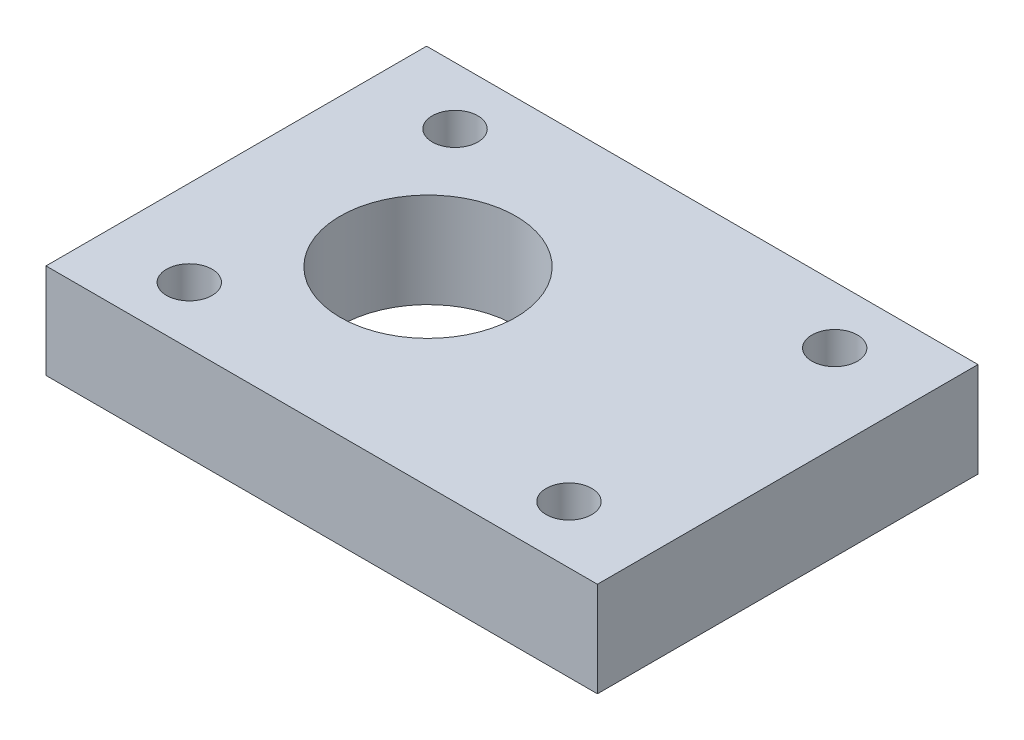
ISO-10303-21;
HEADER;
FILE_DESCRIPTION(('STEP AP214'),'2;1');
FILE_NAME('part.step','',(''),(''),'','','');
FILE_SCHEMA(('AUTOMOTIVE_DESIGN { 1 0 10303 214 1 1 1 1 }'));
ENDSEC;
DATA;
#1=APPLICATION_CONTEXT('core data for automotive mechanical design processes');
#2=APPLICATION_PROTOCOL_DEFINITION('international standard','automotive_design',2000,#1);
#3=PRODUCT_CONTEXT('',#1,'mechanical');
#4=PRODUCT('Part','Part','',(#3));
#5=PRODUCT_RELATED_PRODUCT_CATEGORY('part','',(#4));
#6=PRODUCT_DEFINITION_FORMATION('','',#4);
#7=PRODUCT_DEFINITION_CONTEXT('part definition',#1,'design');
#8=PRODUCT_DEFINITION('design','',#6,#7);
#9=PRODUCT_DEFINITION_SHAPE('','',#8);
#10=(LENGTH_UNIT() NAMED_UNIT(*) SI_UNIT(.MILLI.,.METRE.));
#11=(NAMED_UNIT(*) PLANE_ANGLE_UNIT() SI_UNIT($,.RADIAN.));
#12=(NAMED_UNIT(*) SI_UNIT($,.STERADIAN.) SOLID_ANGLE_UNIT());
#13=UNCERTAINTY_MEASURE_WITH_UNIT(LENGTH_MEASURE(1.E-05),#10,'distance_accuracy_value','');
#14=(GEOMETRIC_REPRESENTATION_CONTEXT(3) GLOBAL_UNCERTAINTY_ASSIGNED_CONTEXT((#13)) GLOBAL_UNIT_ASSIGNED_CONTEXT((#10,
#11,#12)) REPRESENTATION_CONTEXT('',''));
#15=CARTESIAN_POINT('',(0.,0.,0.));
#16=DIRECTION('',(0.,0.,1.));
#17=DIRECTION('',(1.,0.,0.));
#18=AXIS2_PLACEMENT_3D('',#15,#16,#17);
#19=CARTESIAN_POINT('',(11.1296378992842,10.,-4.05838580212253));
#20=DIRECTION('',(0.,0.,-1.));
#21=DIRECTION('',(-1.,0.,0.));
#22=AXIS2_PLACEMENT_3D('',#19,#20,#21);
#23=PLANE('',#22);
#24=DIRECTION('',(1.,0.,0.));
#25=VECTOR('',#24,1.);
#26=CARTESIAN_POINT('',(11.1296378992842,0.,-4.05838580212253));
#27=LINE('',#26,#25);
#28=CARTESIAN_POINT('',(11.1296378992842,0.,-4.05838580212253));
#29=VERTEX_POINT('',#28);
#30=CARTESIAN_POINT('',(69.2296378992842,0.,-4.05838580212253));
#31=VERTEX_POINT('',#30);
#32=EDGE_CURVE('E107',#29,#31,#27,.T.);
#33=ORIENTED_EDGE('',*,*,#32,.T.);
#34=DIRECTION('',(0.,-1.,0.));
#35=VECTOR('',#34,1.);
#36=CARTESIAN_POINT('',(69.2296378992842,10.,-4.05838580212253));
#37=LINE('',#36,#35);
#38=CARTESIAN_POINT('',(69.2296378992842,10.,-4.05838580212253));
#39=VERTEX_POINT('',#38);
#40=EDGE_CURVE('E11',#39,#31,#37,.T.);
#41=ORIENTED_EDGE('',*,*,#40,.F.);
#42=DIRECTION('',(1.,0.,0.));
#43=VECTOR('',#42,1.);
#44=CARTESIAN_POINT('',(11.1296378992842,10.,-4.05838580212253));
#45=LINE('',#44,#43);
#46=CARTESIAN_POINT('',(11.1296378992842,10.,-4.05838580212253));
#47=VERTEX_POINT('',#46);
#48=EDGE_CURVE('E89',#47,#39,#45,.T.);
#49=ORIENTED_EDGE('',*,*,#48,.F.);
#50=DIRECTION('',(0.,-1.,0.));
#51=VECTOR('',#50,1.);
#52=CARTESIAN_POINT('',(11.1296378992842,10.,-4.05838580212253));
#53=LINE('',#52,#51);
#54=EDGE_CURVE('E56',#47,#29,#53,.T.);
#55=ORIENTED_EDGE('',*,*,#54,.T.);
#56=EDGE_LOOP('',(#33,#41,#49,#55));
#57=FACE_BOUND('',#56,.T.);
#58=ADVANCED_FACE('F39',(#57),#23,.F.);
#59=CARTESIAN_POINT('',(69.2296378992842,10.,-4.05838580212253));
#60=DIRECTION('',(-1.,0.,0.));
#61=DIRECTION('',(0.,0.,1.));
#62=AXIS2_PLACEMENT_3D('',#59,#60,#61);
#63=PLANE('',#62);
#64=DIRECTION('',(0.,0.,-1.));
#65=VECTOR('',#64,1.);
#66=CARTESIAN_POINT('',(69.2296378992842,0.,-4.05838580212253));
#67=LINE('',#66,#65);
#68=CARTESIAN_POINT('',(69.2296378992842,0.,-44.1583858021225));
#69=VERTEX_POINT('',#68);
#70=EDGE_CURVE('E95',#31,#69,#67,.T.);
#71=ORIENTED_EDGE('',*,*,#70,.T.);
#72=DIRECTION('',(0.,-1.,0.));
#73=VECTOR('',#72,1.);
#74=CARTESIAN_POINT('',(69.2296378992842,10.,-44.1583858021225));
#75=LINE('',#74,#73);
#76=CARTESIAN_POINT('',(69.2296378992842,10.,-44.1583858021225));
#77=VERTEX_POINT('',#76);
#78=EDGE_CURVE('E48',#77,#69,#75,.T.);
#79=ORIENTED_EDGE('',*,*,#78,.F.);
#80=DIRECTION('',(0.,0.,-1.));
#81=VECTOR('',#80,1.);
#82=CARTESIAN_POINT('',(69.2296378992842,10.,-4.05838580212253));
#83=LINE('',#82,#81);
#84=EDGE_CURVE('E81',#39,#77,#83,.T.);
#85=ORIENTED_EDGE('',*,*,#84,.F.);
#86=ORIENTED_EDGE('',*,*,#40,.T.);
#87=EDGE_LOOP('',(#71,#79,#85,#86));
#88=FACE_BOUND('',#87,.T.);
#89=ADVANCED_FACE('F94',(#88),#63,.F.);
#90=CARTESIAN_POINT('',(11.1296378992842,10.,-44.1583858021225));
#91=DIRECTION('',(0.,0.,-1.));
#92=DIRECTION('',(-1.,0.,0.));
#93=AXIS2_PLACEMENT_3D('',#90,#91,#92);
#94=PLANE('',#93);
#95=DIRECTION('',(1.,0.,0.));
#96=VECTOR('',#95,1.);
#97=CARTESIAN_POINT('',(11.1296378992842,0.,-44.1583858021225));
#98=LINE('',#97,#96);
#99=CARTESIAN_POINT('',(11.1296378992842,0.,-44.1583858021225));
#100=VERTEX_POINT('',#99);
#101=EDGE_CURVE('E113',#100,#69,#98,.T.);
#102=ORIENTED_EDGE('',*,*,#101,.F.);
#103=DIRECTION('',(0.,-1.,0.));
#104=VECTOR('',#103,1.);
#105=CARTESIAN_POINT('',(11.1296378992842,10.,-44.1583858021225));
#106=LINE('',#105,#104);
#107=CARTESIAN_POINT('',(11.1296378992842,10.,-44.1583858021225));
#108=VERTEX_POINT('',#107);
#109=EDGE_CURVE('E70',#108,#100,#106,.T.);
#110=ORIENTED_EDGE('',*,*,#109,.F.);
#111=DIRECTION('',(1.,0.,0.));
#112=VECTOR('',#111,1.);
#113=CARTESIAN_POINT('',(11.1296378992842,10.,-44.1583858021225));
#114=LINE('',#113,#112);
#115=EDGE_CURVE('E88',#108,#77,#114,.T.);
#116=ORIENTED_EDGE('',*,*,#115,.T.);
#117=ORIENTED_EDGE('',*,*,#78,.T.);
#118=EDGE_LOOP('',(#102,#110,#116,#117));
#119=FACE_BOUND('',#118,.T.);
#120=ADVANCED_FACE('F99',(#119),#94,.T.);
#121=CARTESIAN_POINT('',(11.1296378992842,10.,-4.05838580212253));
#122=DIRECTION('',(-1.,0.,0.));
#123=DIRECTION('',(0.,0.,1.));
#124=AXIS2_PLACEMENT_3D('',#121,#122,#123);
#125=PLANE('',#124);
#126=DIRECTION('',(0.,0.,-1.));
#127=VECTOR('',#126,1.);
#128=CARTESIAN_POINT('',(11.1296378992842,0.,-4.05838580212253));
#129=LINE('',#128,#127);
#130=EDGE_CURVE('E116',#29,#100,#129,.T.);
#131=ORIENTED_EDGE('',*,*,#130,.F.);
#132=ORIENTED_EDGE('',*,*,#54,.F.);
#133=DIRECTION('',(0.,0.,-1.));
#134=VECTOR('',#133,1.);
#135=CARTESIAN_POINT('',(11.1296378992842,10.,-4.05838580212253));
#136=LINE('',#135,#134);
#137=EDGE_CURVE('E101',#47,#108,#136,.T.);
#138=ORIENTED_EDGE('',*,*,#137,.T.);
#139=ORIENTED_EDGE('',*,*,#109,.T.);
#140=EDGE_LOOP('',(#131,#132,#138,#139));
#141=FACE_BOUND('',#140,.T.);
#142=ADVANCED_FACE('F189',(#141),#125,.T.);
#143=CARTESIAN_POINT('',(0.,10.,0.));
#144=DIRECTION('',(0.,1.,0.));
#145=DIRECTION('',(0.,0.,1.));
#146=AXIS2_PLACEMENT_3D('',#143,#144,#145);
#147=PLANE('',#146);
#148=CARTESIAN_POINT('',(60.1796378992842,10.,-38.1083858021225));
#149=DIRECTION('',(0.,1.,0.));
#150=DIRECTION('',(0.,0.,1.));
#151=AXIS2_PLACEMENT_3D('',#148,#149,#150);
#152=CIRCLE('',#151,2.40000000000001);
#153=CARTESIAN_POINT('',(60.1796378992842,10.,-35.7083858021225));
#154=VERTEX_POINT('',#153);
#155=EDGE_CURVE('E142',#154,#154,#152,.T.);
#156=ORIENTED_EDGE('',*,*,#155,.F.);
#157=EDGE_LOOP('',(#156));
#158=FACE_BOUND('',#157,.T.);
#159=CARTESIAN_POINT('',(60.1796378992842,10.,-10.1083858021225));
#160=DIRECTION('',(0.,1.,0.));
#161=DIRECTION('',(0.,0.,1.));
#162=AXIS2_PLACEMENT_3D('',#159,#160,#161);
#163=CIRCLE('',#162,2.4);
#164=CARTESIAN_POINT('',(60.1796378992842,10.,-7.70838580212253));
#165=VERTEX_POINT('',#164);
#166=EDGE_CURVE('E150',#165,#165,#163,.T.);
#167=ORIENTED_EDGE('',*,*,#166,.F.);
#168=EDGE_LOOP('',(#167));
#169=FACE_BOUND('',#168,.T.);
#170=CARTESIAN_POINT('',(20.1796378992842,10.,-10.1083858021225));
#171=DIRECTION('',(0.,1.,0.));
#172=DIRECTION('',(0.,0.,1.));
#173=AXIS2_PLACEMENT_3D('',#170,#171,#172);
#174=CIRCLE('',#173,2.4);
#175=CARTESIAN_POINT('',(20.1796378992842,10.,-7.70838580212253));
#176=VERTEX_POINT('',#175);
#177=EDGE_CURVE('E158',#176,#176,#174,.T.);
#178=ORIENTED_EDGE('',*,*,#177,.F.);
#179=EDGE_LOOP('',(#178));
#180=FACE_BOUND('',#179,.T.);
#181=CARTESIAN_POINT('',(20.1796378992842,10.,-38.1083858021225));
#182=DIRECTION('',(0.,1.,0.));
#183=DIRECTION('',(0.,0.,1.));
#184=AXIS2_PLACEMENT_3D('',#181,#182,#183);
#185=CIRCLE('',#184,2.4);
#186=CARTESIAN_POINT('',(20.1796378992842,10.,-35.7083858021225));
#187=VERTEX_POINT('',#186);
#188=EDGE_CURVE('E130',#187,#187,#185,.T.);
#189=ORIENTED_EDGE('',*,*,#188,.F.);
#190=EDGE_LOOP('',(#189));
#191=FACE_BOUND('',#190,.T.);
#192=CARTESIAN_POINT('',(31.3296378992842,10.,-24.1083858021225));
#193=DIRECTION('',(0.,1.,0.));
#194=DIRECTION('',(0.,0.,1.));
#195=AXIS2_PLACEMENT_3D('',#192,#193,#194);
#196=CIRCLE('',#195,9.25);
#197=CARTESIAN_POINT('',(31.3296378992842,10.,-14.8583858021225));
#198=VERTEX_POINT('',#197);
#199=EDGE_CURVE('E110',#198,#198,#196,.T.);
#200=ORIENTED_EDGE('',*,*,#199,.F.);
#201=EDGE_LOOP('',(#200));
#202=FACE_BOUND('',#201,.T.);
#203=ORIENTED_EDGE('',*,*,#48,.T.);
#204=ORIENTED_EDGE('',*,*,#84,.T.);
#205=ORIENTED_EDGE('',*,*,#115,.F.);
#206=ORIENTED_EDGE('',*,*,#137,.F.);
#207=EDGE_LOOP('',(#203,#204,#205,#206));
#208=FACE_BOUND('',#207,.T.);
#209=ADVANCED_FACE('F85',(#158,#169,#180,#191,#202,#208),#147,.T.);
#210=CARTESIAN_POINT('',(0.,0.,0.));
#211=DIRECTION('',(0.,1.,0.));
#212=DIRECTION('',(0.,0.,1.));
#213=AXIS2_PLACEMENT_3D('',#210,#211,#212);
#214=PLANE('',#213);
#215=CARTESIAN_POINT('',(60.1796378992842,0.,-38.1083858021225));
#216=DIRECTION('',(0.,1.,0.));
#217=DIRECTION('',(0.,0.,1.));
#218=AXIS2_PLACEMENT_3D('',#215,#216,#217);
#219=CIRCLE('',#218,2.40000000000001);
#220=CARTESIAN_POINT('',(60.1796378992842,0.,-35.7083858021225));
#221=VERTEX_POINT('',#220);
#222=EDGE_CURVE('E146',#221,#221,#219,.T.);
#223=ORIENTED_EDGE('',*,*,#222,.T.);
#224=EDGE_LOOP('',(#223));
#225=FACE_BOUND('',#224,.T.);
#226=CARTESIAN_POINT('',(60.1796378992842,0.,-10.1083858021225));
#227=DIRECTION('',(0.,1.,0.));
#228=DIRECTION('',(0.,0.,1.));
#229=AXIS2_PLACEMENT_3D('',#226,#227,#228);
#230=CIRCLE('',#229,2.4);
#231=CARTESIAN_POINT('',(60.1796378992842,0.,-7.70838580212253));
#232=VERTEX_POINT('',#231);
#233=EDGE_CURVE('E154',#232,#232,#230,.T.);
#234=ORIENTED_EDGE('',*,*,#233,.T.);
#235=EDGE_LOOP('',(#234));
#236=FACE_BOUND('',#235,.T.);
#237=CARTESIAN_POINT('',(20.1796378992842,0.,-10.1083858021225));
#238=DIRECTION('',(0.,1.,0.));
#239=DIRECTION('',(0.,0.,1.));
#240=AXIS2_PLACEMENT_3D('',#237,#238,#239);
#241=CIRCLE('',#240,2.4);
#242=CARTESIAN_POINT('',(20.1796378992842,0.,-7.70838580212253));
#243=VERTEX_POINT('',#242);
#244=EDGE_CURVE('E138',#243,#243,#241,.T.);
#245=ORIENTED_EDGE('',*,*,#244,.T.);
#246=EDGE_LOOP('',(#245));
#247=FACE_BOUND('',#246,.T.);
#248=CARTESIAN_POINT('',(20.1796378992842,0.,-38.1083858021225));
#249=DIRECTION('',(0.,1.,0.));
#250=DIRECTION('',(0.,0.,1.));
#251=AXIS2_PLACEMENT_3D('',#248,#249,#250);
#252=CIRCLE('',#251,2.4);
#253=CARTESIAN_POINT('',(20.1796378992842,0.,-35.7083858021225));
#254=VERTEX_POINT('',#253);
#255=EDGE_CURVE('E134',#254,#254,#252,.T.);
#256=ORIENTED_EDGE('',*,*,#255,.T.);
#257=EDGE_LOOP('',(#256));
#258=FACE_BOUND('',#257,.T.);
#259=CARTESIAN_POINT('',(31.3296378992842,0.,-24.1083858021225));
#260=DIRECTION('',(0.,1.,0.));
#261=DIRECTION('',(0.,0.,1.));
#262=AXIS2_PLACEMENT_3D('',#259,#260,#261);
#263=CIRCLE('',#262,9.25);
#264=CARTESIAN_POINT('',(31.3296378992842,0.,-14.8583858021225));
#265=VERTEX_POINT('',#264);
#266=EDGE_CURVE('E126',#265,#265,#263,.T.);
#267=ORIENTED_EDGE('',*,*,#266,.T.);
#268=EDGE_LOOP('',(#267));
#269=FACE_BOUND('',#268,.T.);
#270=ORIENTED_EDGE('',*,*,#32,.F.);
#271=ORIENTED_EDGE('',*,*,#130,.T.);
#272=ORIENTED_EDGE('',*,*,#101,.T.);
#273=ORIENTED_EDGE('',*,*,#70,.F.);
#274=EDGE_LOOP('',(#270,#271,#272,#273));
#275=FACE_BOUND('',#274,.T.);
#276=ADVANCED_FACE('F166',(#225,#236,#247,#258,#269,#275),#214,.F.);
#277=CARTESIAN_POINT('',(31.3296378992842,10.,-24.1083858021225));
#278=DIRECTION('',(0.,-1.,0.));
#279=DIRECTION('',(0.,0.,-1.));
#280=AXIS2_PLACEMENT_3D('',#277,#278,#279);
#281=CYLINDRICAL_SURFACE('',#280,9.25);
#282=ORIENTED_EDGE('',*,*,#199,.T.);
#283=EDGE_LOOP('',(#282));
#284=FACE_BOUND('',#283,.T.);
#285=ORIENTED_EDGE('',*,*,#266,.F.);
#286=EDGE_LOOP('',(#285));
#287=FACE_BOUND('',#286,.T.);
#288=ADVANCED_FACE('F182',(#284,#287),#281,.F.);
#289=CARTESIAN_POINT('',(20.1796378992842,10.,-38.1083858021225));
#290=DIRECTION('',(0.,-1.,0.));
#291=DIRECTION('',(0.,0.,-1.));
#292=AXIS2_PLACEMENT_3D('',#289,#290,#291);
#293=CYLINDRICAL_SURFACE('',#292,2.4);
#294=ORIENTED_EDGE('',*,*,#188,.T.);
#295=EDGE_LOOP('',(#294));
#296=FACE_BOUND('',#295,.T.);
#297=ORIENTED_EDGE('',*,*,#255,.F.);
#298=EDGE_LOOP('',(#297));
#299=FACE_BOUND('',#298,.T.);
#300=ADVANCED_FACE('F172',(#296,#299),#293,.F.);
#301=CARTESIAN_POINT('',(20.1796378992842,10.,-10.1083858021225));
#302=DIRECTION('',(0.,-1.,0.));
#303=DIRECTION('',(0.,0.,-1.));
#304=AXIS2_PLACEMENT_3D('',#301,#302,#303);
#305=CYLINDRICAL_SURFACE('',#304,2.4);
#306=ORIENTED_EDGE('',*,*,#177,.T.);
#307=EDGE_LOOP('',(#306));
#308=FACE_BOUND('',#307,.T.);
#309=ORIENTED_EDGE('',*,*,#244,.F.);
#310=EDGE_LOOP('',(#309));
#311=FACE_BOUND('',#310,.T.);
#312=ADVANCED_FACE('F169',(#308,#311),#305,.F.);
#313=CARTESIAN_POINT('',(60.1796378992842,10.,-10.1083858021225));
#314=DIRECTION('',(0.,-1.,0.));
#315=DIRECTION('',(0.,0.,-1.));
#316=AXIS2_PLACEMENT_3D('',#313,#314,#315);
#317=CYLINDRICAL_SURFACE('',#316,2.4);
#318=ORIENTED_EDGE('',*,*,#166,.T.);
#319=EDGE_LOOP('',(#318));
#320=FACE_BOUND('',#319,.T.);
#321=ORIENTED_EDGE('',*,*,#233,.F.);
#322=EDGE_LOOP('',(#321));
#323=FACE_BOUND('',#322,.T.);
#324=ADVANCED_FACE('F171',(#320,#323),#317,.F.);
#325=CARTESIAN_POINT('',(60.1796378992842,10.,-38.1083858021225));
#326=DIRECTION('',(0.,-1.,0.));
#327=DIRECTION('',(0.,0.,-1.));
#328=AXIS2_PLACEMENT_3D('',#325,#326,#327);
#329=CYLINDRICAL_SURFACE('',#328,2.40000000000001);
#330=ORIENTED_EDGE('',*,*,#155,.T.);
#331=EDGE_LOOP('',(#330));
#332=FACE_BOUND('',#331,.T.);
#333=ORIENTED_EDGE('',*,*,#222,.F.);
#334=EDGE_LOOP('',(#333));
#335=FACE_BOUND('',#334,.T.);
#336=ADVANCED_FACE('F179',(#332,#335),#329,.F.);
#337=CLOSED_SHELL('',(#58,#89,#120,#142,#209,#276,#288,#300,#312,#324,#336));
#338=MANIFOLD_SOLID_BREP('B2',#337);
#339=ADVANCED_BREP_SHAPE_REPRESENTATION('',(#18,#338),#14);
#340=SHAPE_DEFINITION_REPRESENTATION(#9,#339);
ENDSEC;
END-ISO-10303-21;
